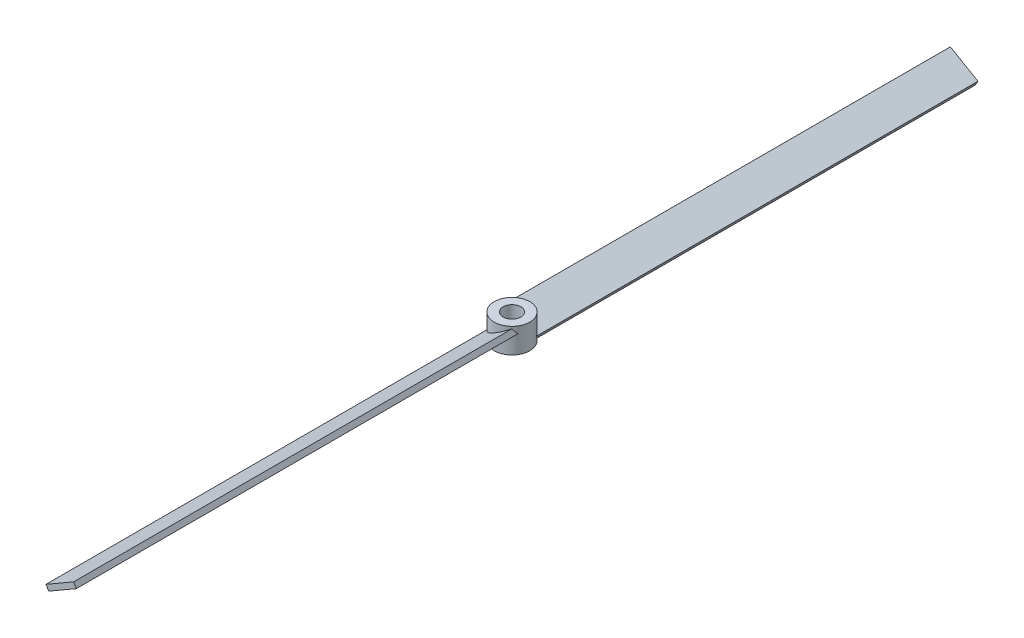
ISO-10303-21;
HEADER;
FILE_DESCRIPTION(('STEP AP214'),'2;1');
FILE_NAME('part.step','',(''),(''),'','','');
FILE_SCHEMA(('AUTOMOTIVE_DESIGN { 1 0 10303 214 1 1 1 1 }'));
ENDSEC;
DATA;
#1=APPLICATION_CONTEXT('core data for automotive mechanical design processes');
#2=APPLICATION_PROTOCOL_DEFINITION('international standard','automotive_design',2000,#1);
#3=PRODUCT_CONTEXT('',#1,'mechanical');
#4=PRODUCT('Part','Part','',(#3));
#5=PRODUCT_RELATED_PRODUCT_CATEGORY('part','',(#4));
#6=PRODUCT_DEFINITION_FORMATION('','',#4);
#7=PRODUCT_DEFINITION_CONTEXT('part definition',#1,'design');
#8=PRODUCT_DEFINITION('design','',#6,#7);
#9=PRODUCT_DEFINITION_SHAPE('','',#8);
#10=(LENGTH_UNIT() NAMED_UNIT(*) SI_UNIT(.MILLI.,.METRE.));
#11=(NAMED_UNIT(*) PLANE_ANGLE_UNIT() SI_UNIT($,.RADIAN.));
#12=(NAMED_UNIT(*) SI_UNIT($,.STERADIAN.) SOLID_ANGLE_UNIT());
#13=UNCERTAINTY_MEASURE_WITH_UNIT(LENGTH_MEASURE(1.E-05),#10,'distance_accuracy_value','');
#14=(GEOMETRIC_REPRESENTATION_CONTEXT(3) GLOBAL_UNCERTAINTY_ASSIGNED_CONTEXT((#13)) GLOBAL_UNIT_ASSIGNED_CONTEXT((#10,
#11,#12)) REPRESENTATION_CONTEXT('',''));
#15=CARTESIAN_POINT('',(0.,0.,0.));
#16=DIRECTION('',(0.,0.,1.));
#17=DIRECTION('',(1.,0.,0.));
#18=AXIS2_PLACEMENT_3D('',#15,#16,#17);
#19=CARTESIAN_POINT('',(0.,7.,0.));
#20=DIRECTION('',(0.,-1.,0.));
#21=DIRECTION('',(0.,0.,-1.));
#22=AXIS2_PLACEMENT_3D('',#19,#20,#21);
#23=CYLINDRICAL_SURFACE('',#22,5.);
#24=CARTESIAN_POINT('',(0.,-5.50000000000009,0.));
#25=DIRECTION('',(0.866025403784442,0.499999999999995,0.));
#26=DIRECTION('',(0.499999999999995,-0.866025403784442,0.));
#27=AXIS2_PLACEMENT_3D('',#24,#25,#26);
#28=ELLIPSE('',#27,10.0000000000001,5.);
#29=CARTESIAN_POINT('',(-4.27211431702998,1.89951905283836,2.59789131070332));
#30=VERTEX_POINT('',#29);
#31=CARTESIAN_POINT('',(-3.52211431702999,0.600480947161693,3.54890275124196));
#32=VERTEX_POINT('',#31);
#33=EDGE_CURVE('E157',#30,#32,#28,.T.);
#34=ORIENTED_EDGE('',*,*,#33,.F.);
#35=CARTESIAN_POINT('',(0.,4.36602540378444,0.));
#36=DIRECTION('',(0.499999999999995,-0.866025403784442,0.));
#37=DIRECTION('',(-0.866025403784442,-0.499999999999995,0.));
#38=AXIS2_PLACEMENT_3D('',#35,#36,#37);
#39=ELLIPSE('',#38,5.77350269189624,5.);
#40=CARTESIAN_POINT('',(3.52211431702999,6.39951905283831,3.54890275124196));
#41=VERTEX_POINT('',#40);
#42=EDGE_CURVE('E146',#41,#30,#39,.T.);
#43=ORIENTED_EDGE('',*,*,#42,.F.);
#44=CARTESIAN_POINT('',(0.,12.5000000000001,0.));
#45=DIRECTION('',(-0.866025403784442,-0.499999999999995,0.));
#46=DIRECTION('',(0.499999999999995,-0.866025403784442,0.));
#47=AXIS2_PLACEMENT_3D('',#44,#45,#46);
#48=ELLIPSE('',#47,10.0000000000001,5.);
#49=CARTESIAN_POINT('',(4.27211431702998,5.10048094716165,2.59789131070326));
#50=VERTEX_POINT('',#49);
#51=EDGE_CURVE('E151',#50,#41,#48,.T.);
#52=ORIENTED_EDGE('',*,*,#51,.F.);
#53=CARTESIAN_POINT('',(0.,2.63397459621557,0.));
#54=DIRECTION('',(-0.499999999999995,0.866025403784441,0.));
#55=DIRECTION('',(-0.866025403784442,-0.499999999999995,0.));
#56=AXIS2_PLACEMENT_3D('',#53,#54,#55);
#57=ELLIPSE('',#56,5.77350269189624,5.);
#58=EDGE_CURVE('E154',#32,#50,#57,.T.);
#59=ORIENTED_EDGE('',*,*,#58,.F.);
#60=EDGE_LOOP('',(#34,#43,#52,#59));
#61=FACE_BOUND('',#60,.T.);
#62=CARTESIAN_POINT('',(0.,7.,0.));
#63=DIRECTION('',(0.,1.,0.));
#64=DIRECTION('',(0.,0.,1.));
#65=AXIS2_PLACEMENT_3D('',#62,#63,#64);
#66=CIRCLE('',#65,5.);
#67=CARTESIAN_POINT('',(0.,7.,5.));
#68=VERTEX_POINT('',#67);
#69=EDGE_CURVE('E143',#68,#68,#66,.T.);
#70=ORIENTED_EDGE('',*,*,#69,.F.);
#71=EDGE_LOOP('',(#70));
#72=FACE_BOUND('',#71,.T.);
#73=CARTESIAN_POINT('',(0.,0.,0.));
#74=DIRECTION('',(0.,1.,0.));
#75=DIRECTION('',(0.,0.,1.));
#76=AXIS2_PLACEMENT_3D('',#73,#74,#75);
#77=CIRCLE('',#76,5.);
#78=CARTESIAN_POINT('',(0.,0.,5.));
#79=VERTEX_POINT('',#78);
#80=EDGE_CURVE('E142',#79,#79,#77,.T.);
#81=ORIENTED_EDGE('',*,*,#80,.T.);
#82=EDGE_LOOP('',(#81));
#83=FACE_BOUND('',#82,.T.);
#84=CARTESIAN_POINT('',(0.,-5.50000000000009,0.));
#85=DIRECTION('',(-0.866025403784442,0.499999999999995,0.));
#86=DIRECTION('',(-0.499999999999995,-0.866025403784442,0.));
#87=AXIS2_PLACEMENT_3D('',#84,#85,#86);
#88=ELLIPSE('',#87,10.0000000000001,5.);
#89=CARTESIAN_POINT('',(4.27211431702998,1.89951905283836,-2.59789131070332));
#90=VERTEX_POINT('',#89);
#91=CARTESIAN_POINT('',(3.52211431702999,0.600480947161693,-3.54890275124196));
#92=VERTEX_POINT('',#91);
#93=EDGE_CURVE('E11',#90,#92,#88,.T.);
#94=ORIENTED_EDGE('',*,*,#93,.F.);
#95=CARTESIAN_POINT('',(0.,4.36602540378444,0.));
#96=DIRECTION('',(-0.499999999999995,-0.866025403784442,0.));
#97=DIRECTION('',(0.866025403784442,-0.499999999999995,0.));
#98=AXIS2_PLACEMENT_3D('',#95,#96,#97);
#99=ELLIPSE('',#98,5.77350269189624,5.);
#100=CARTESIAN_POINT('',(-3.52211431702999,6.39951905283831,-3.54890275124196));
#101=VERTEX_POINT('',#100);
#102=EDGE_CURVE('E160',#101,#90,#99,.T.);
#103=ORIENTED_EDGE('',*,*,#102,.F.);
#104=CARTESIAN_POINT('',(0.,12.5000000000001,0.));
#105=DIRECTION('',(0.866025403784442,-0.499999999999995,0.));
#106=DIRECTION('',(-0.499999999999995,-0.866025403784442,0.));
#107=AXIS2_PLACEMENT_3D('',#104,#105,#106);
#108=ELLIPSE('',#107,10.0000000000001,5.);
#109=CARTESIAN_POINT('',(-4.27211431702998,5.10048094716165,-2.59789131070326));
#110=VERTEX_POINT('',#109);
#111=EDGE_CURVE('E51',#110,#101,#108,.T.);
#112=ORIENTED_EDGE('',*,*,#111,.F.);
#113=CARTESIAN_POINT('',(0.,2.63397459621557,0.));
#114=DIRECTION('',(0.499999999999995,0.866025403784441,0.));
#115=DIRECTION('',(0.866025403784442,-0.499999999999995,0.));
#116=AXIS2_PLACEMENT_3D('',#113,#114,#115);
#117=ELLIPSE('',#116,5.77350269189624,5.);
#118=EDGE_CURVE('E41',#92,#110,#117,.T.);
#119=ORIENTED_EDGE('',*,*,#118,.F.);
#120=EDGE_LOOP('',(#94,#103,#112,#119));
#121=FACE_BOUND('',#120,.T.);
#122=ADVANCED_FACE('F34',(#61,#72,#83,#121),#23,.T.);
#123=CARTESIAN_POINT('',(0.,7.,0.));
#124=DIRECTION('',(0.,1.,0.));
#125=DIRECTION('',(0.,0.,1.));
#126=AXIS2_PLACEMENT_3D('',#123,#124,#125);
#127=PLANE('',#126);
#128=CARTESIAN_POINT('',(0.,7.,0.));
#129=DIRECTION('',(0.,1.,0.));
#130=DIRECTION('',(0.,0.,1.));
#131=AXIS2_PLACEMENT_3D('',#128,#129,#130);
#132=CIRCLE('',#131,2.5);
#133=CARTESIAN_POINT('',(0.,7.,2.5));
#134=VERTEX_POINT('',#133);
#135=EDGE_CURVE('E231',#134,#134,#132,.T.);
#136=ORIENTED_EDGE('',*,*,#135,.F.);
#137=EDGE_LOOP('',(#136));
#138=FACE_BOUND('',#137,.T.);
#139=ORIENTED_EDGE('',*,*,#69,.T.);
#140=EDGE_LOOP('',(#139));
#141=FACE_BOUND('',#140,.T.);
#142=ADVANCED_FACE('F174',(#138,#141),#127,.T.);
#143=CARTESIAN_POINT('',(0.,0.,0.));
#144=DIRECTION('',(0.,1.,0.));
#145=DIRECTION('',(0.,0.,1.));
#146=AXIS2_PLACEMENT_3D('',#143,#144,#145);
#147=PLANE('',#146);
#148=CARTESIAN_POINT('',(0.,0.,0.));
#149=DIRECTION('',(0.,1.,0.));
#150=DIRECTION('',(0.,0.,1.));
#151=AXIS2_PLACEMENT_3D('',#148,#149,#150);
#152=CIRCLE('',#151,2.5);
#153=CARTESIAN_POINT('',(0.,0.,2.5));
#154=VERTEX_POINT('',#153);
#155=EDGE_CURVE('E113',#154,#154,#152,.F.);
#156=ORIENTED_EDGE('',*,*,#155,.F.);
#157=EDGE_LOOP('',(#156));
#158=FACE_BOUND('',#157,.T.);
#159=ORIENTED_EDGE('',*,*,#80,.F.);
#160=EDGE_LOOP('',(#159));
#161=FACE_BOUND('',#160,.T.);
#162=ADVANCED_FACE('F179',(#158,#161),#147,.F.);
#163=CARTESIAN_POINT('',(-4.27211431702998,1.89951905283836,127.));
#164=DIRECTION('',(0.866025403784442,0.499999999999995,0.));
#165=DIRECTION('',(-0.499999999999995,0.866025403784442,0.));
#166=AXIS2_PLACEMENT_3D('',#163,#164,#165);
#167=PLANE('',#166);
#168=DIRECTION('',(0.,0.,-1.));
#169=VECTOR('',#168,1.);
#170=CARTESIAN_POINT('',(-4.27211431702998,1.89951905283836,127.));
#171=LINE('',#170,#169);
#172=CARTESIAN_POINT('',(-4.27211431702998,1.89951905283836,127.));
#173=VERTEX_POINT('',#172);
#174=EDGE_CURVE('E130',#173,#30,#171,.T.);
#175=ORIENTED_EDGE('',*,*,#174,.T.);
#176=ORIENTED_EDGE('',*,*,#33,.T.);
#177=DIRECTION('',(0.,0.,-1.));
#178=VECTOR('',#177,1.);
#179=CARTESIAN_POINT('',(-3.52211431702999,0.600480947161693,127.));
#180=LINE('',#179,#178);
#181=CARTESIAN_POINT('',(-3.52211431702999,0.600480947161693,127.));
#182=VERTEX_POINT('',#181);
#183=EDGE_CURVE('E139',#182,#32,#180,.T.);
#184=ORIENTED_EDGE('',*,*,#183,.F.);
#185=DIRECTION('',(0.499999999999995,-0.866025403784442,0.));
#186=VECTOR('',#185,1.);
#187=CARTESIAN_POINT('',(-4.27211431702998,1.89951905283836,127.));
#188=LINE('',#187,#186);
#189=EDGE_CURVE('E116',#173,#182,#188,.T.);
#190=ORIENTED_EDGE('',*,*,#189,.F.);
#191=EDGE_LOOP('',(#175,#176,#184,#190));
#192=FACE_BOUND('',#191,.T.);
#193=ADVANCED_FACE('F188',(#192),#167,.F.);
#194=CARTESIAN_POINT('',(-3.52211431702999,0.600480947161693,127.));
#195=DIRECTION('',(-0.499999999999995,0.866025403784441,0.));
#196=DIRECTION('',(-0.866025403784442,-0.499999999999995,0.));
#197=AXIS2_PLACEMENT_3D('',#194,#195,#196);
#198=PLANE('',#197);
#199=ORIENTED_EDGE('',*,*,#183,.T.);
#200=ORIENTED_EDGE('',*,*,#58,.T.);
#201=DIRECTION('',(0.,0.,-1.));
#202=VECTOR('',#201,1.);
#203=CARTESIAN_POINT('',(4.27211431702998,5.10048094716165,127.));
#204=LINE('',#203,#202);
#205=CARTESIAN_POINT('',(4.27211431702998,5.10048094716165,127.));
#206=VERTEX_POINT('',#205);
#207=EDGE_CURVE('E136',#206,#50,#204,.T.);
#208=ORIENTED_EDGE('',*,*,#207,.F.);
#209=DIRECTION('',(0.866025403784441,0.499999999999995,0.));
#210=VECTOR('',#209,1.);
#211=CARTESIAN_POINT('',(-3.52211431702999,0.600480947161693,127.));
#212=LINE('',#211,#210);
#213=EDGE_CURVE('E119',#182,#206,#212,.T.);
#214=ORIENTED_EDGE('',*,*,#213,.F.);
#215=EDGE_LOOP('',(#199,#200,#208,#214));
#216=FACE_BOUND('',#215,.T.);
#217=ADVANCED_FACE('F193',(#216),#198,.F.);
#218=CARTESIAN_POINT('',(3.52211431702999,6.39951905283831,127.));
#219=DIRECTION('',(-0.866025403784442,-0.499999999999995,0.));
#220=DIRECTION('',(0.499999999999995,-0.866025403784442,0.));
#221=AXIS2_PLACEMENT_3D('',#218,#219,#220);
#222=PLANE('',#221);
#223=ORIENTED_EDGE('',*,*,#207,.T.);
#224=ORIENTED_EDGE('',*,*,#51,.T.);
#225=DIRECTION('',(0.,0.,-1.));
#226=VECTOR('',#225,1.);
#227=CARTESIAN_POINT('',(3.52211431702999,6.39951905283831,127.));
#228=LINE('',#227,#226);
#229=CARTESIAN_POINT('',(3.52211431702999,6.39951905283831,127.));
#230=VERTEX_POINT('',#229);
#231=EDGE_CURVE('E133',#230,#41,#228,.T.);
#232=ORIENTED_EDGE('',*,*,#231,.F.);
#233=DIRECTION('',(-0.499999999999995,0.866025403784442,0.));
#234=VECTOR('',#233,1.);
#235=CARTESIAN_POINT('',(3.52211431702999,6.39951905283831,127.));
#236=LINE('',#235,#234);
#237=EDGE_CURVE('E126',#206,#230,#236,.T.);
#238=ORIENTED_EDGE('',*,*,#237,.F.);
#239=EDGE_LOOP('',(#223,#224,#232,#238));
#240=FACE_BOUND('',#239,.T.);
#241=ADVANCED_FACE('F200',(#240),#222,.F.);
#242=CARTESIAN_POINT('',(-4.27211431702998,1.89951905283836,127.));
#243=DIRECTION('',(0.499999999999995,-0.866025403784442,0.));
#244=DIRECTION('',(0.866025403784442,0.499999999999995,0.));
#245=AXIS2_PLACEMENT_3D('',#242,#243,#244);
#246=PLANE('',#245);
#247=ORIENTED_EDGE('',*,*,#231,.T.);
#248=ORIENTED_EDGE('',*,*,#42,.T.);
#249=ORIENTED_EDGE('',*,*,#174,.F.);
#250=DIRECTION('',(-0.866025403784442,-0.499999999999995,0.));
#251=VECTOR('',#250,1.);
#252=CARTESIAN_POINT('',(-4.27211431702998,1.89951905283836,127.));
#253=LINE('',#252,#251);
#254=EDGE_CURVE('E128',#230,#173,#253,.T.);
#255=ORIENTED_EDGE('',*,*,#254,.F.);
#256=EDGE_LOOP('',(#247,#248,#249,#255));
#257=FACE_BOUND('',#256,.T.);
#258=ADVANCED_FACE('F204',(#257),#246,.F.);
#259=CARTESIAN_POINT('',(0.,0.,127.));
#260=DIRECTION('',(0.,0.,1.));
#261=DIRECTION('',(1.,0.,0.));
#262=AXIS2_PLACEMENT_3D('',#259,#260,#261);
#263=PLANE('',#262);
#264=ORIENTED_EDGE('',*,*,#189,.T.);
#265=ORIENTED_EDGE('',*,*,#213,.T.);
#266=ORIENTED_EDGE('',*,*,#237,.T.);
#267=ORIENTED_EDGE('',*,*,#254,.T.);
#268=EDGE_LOOP('',(#264,#265,#266,#267));
#269=FACE_BOUND('',#268,.T.);
#270=ADVANCED_FACE('F208',(#269),#263,.T.);
#271=CARTESIAN_POINT('',(4.27211431702998,1.89951905283836,-127.));
#272=DIRECTION('',(-0.866025403784442,0.499999999999995,0.));
#273=DIRECTION('',(-0.499999999999995,-0.866025403784442,0.));
#274=AXIS2_PLACEMENT_3D('',#271,#272,#273);
#275=PLANE('',#274);
#276=DIRECTION('',(0.,0.,1.));
#277=VECTOR('',#276,1.);
#278=CARTESIAN_POINT('',(4.27211431702998,1.89951905283836,-127.));
#279=LINE('',#278,#277);
#280=CARTESIAN_POINT('',(4.27211431702998,1.89951905283836,-127.));
#281=VERTEX_POINT('',#280);
#282=EDGE_CURVE('E168',#281,#90,#279,.T.);
#283=ORIENTED_EDGE('',*,*,#282,.T.);
#284=ORIENTED_EDGE('',*,*,#93,.T.);
#285=DIRECTION('',(0.,0.,1.));
#286=VECTOR('',#285,1.);
#287=CARTESIAN_POINT('',(3.52211431702999,0.600480947161693,-127.));
#288=LINE('',#287,#286);
#289=CARTESIAN_POINT('',(3.52211431702999,0.600480947161693,-127.));
#290=VERTEX_POINT('',#289);
#291=EDGE_CURVE('E98',#290,#92,#288,.T.);
#292=ORIENTED_EDGE('',*,*,#291,.F.);
#293=DIRECTION('',(-0.499999999999995,-0.866025403784442,0.));
#294=VECTOR('',#293,1.);
#295=CARTESIAN_POINT('',(4.27211431702998,1.89951905283836,-127.));
#296=LINE('',#295,#294);
#297=EDGE_CURVE('E104',#281,#290,#296,.T.);
#298=ORIENTED_EDGE('',*,*,#297,.F.);
#299=EDGE_LOOP('',(#283,#284,#292,#298));
#300=FACE_BOUND('',#299,.T.);
#301=ADVANCED_FACE('F115',(#300),#275,.F.);
#302=CARTESIAN_POINT('',(3.52211431702999,0.600480947161693,-127.));
#303=DIRECTION('',(0.499999999999995,0.866025403784441,0.));
#304=DIRECTION('',(-0.866025403784442,0.499999999999995,0.));
#305=AXIS2_PLACEMENT_3D('',#302,#303,#304);
#306=PLANE('',#305);
#307=ORIENTED_EDGE('',*,*,#291,.T.);
#308=ORIENTED_EDGE('',*,*,#118,.T.);
#309=DIRECTION('',(0.,0.,1.));
#310=VECTOR('',#309,1.);
#311=CARTESIAN_POINT('',(-4.27211431702998,5.10048094716165,-127.));
#312=LINE('',#311,#310);
#313=CARTESIAN_POINT('',(-4.27211431702998,5.10048094716165,-127.));
#314=VERTEX_POINT('',#313);
#315=EDGE_CURVE('E100',#314,#110,#312,.T.);
#316=ORIENTED_EDGE('',*,*,#315,.F.);
#317=DIRECTION('',(-0.866025403784441,0.499999999999995,0.));
#318=VECTOR('',#317,1.);
#319=CARTESIAN_POINT('',(3.52211431702999,0.600480947161693,-127.));
#320=LINE('',#319,#318);
#321=EDGE_CURVE('E94',#290,#314,#320,.T.);
#322=ORIENTED_EDGE('',*,*,#321,.F.);
#323=EDGE_LOOP('',(#307,#308,#316,#322));
#324=FACE_BOUND('',#323,.T.);
#325=ADVANCED_FACE('F96',(#324),#306,.F.);
#326=CARTESIAN_POINT('',(-3.52211431702999,6.39951905283831,-127.));
#327=DIRECTION('',(0.866025403784442,-0.499999999999995,0.));
#328=DIRECTION('',(0.499999999999995,0.866025403784442,0.));
#329=AXIS2_PLACEMENT_3D('',#326,#327,#328);
#330=PLANE('',#329);
#331=ORIENTED_EDGE('',*,*,#315,.T.);
#332=ORIENTED_EDGE('',*,*,#111,.T.);
#333=DIRECTION('',(0.,0.,1.));
#334=VECTOR('',#333,1.);
#335=CARTESIAN_POINT('',(-3.52211431702999,6.39951905283831,-127.));
#336=LINE('',#335,#334);
#337=CARTESIAN_POINT('',(-3.52211431702999,6.39951905283831,-127.));
#338=VERTEX_POINT('',#337);
#339=EDGE_CURVE('E121',#338,#101,#336,.T.);
#340=ORIENTED_EDGE('',*,*,#339,.F.);
#341=DIRECTION('',(0.499999999999995,0.866025403784442,0.));
#342=VECTOR('',#341,1.);
#343=CARTESIAN_POINT('',(-3.52211431702999,6.39951905283831,-127.));
#344=LINE('',#343,#342);
#345=EDGE_CURVE('E103',#314,#338,#344,.T.);
#346=ORIENTED_EDGE('',*,*,#345,.F.);
#347=EDGE_LOOP('',(#331,#332,#340,#346));
#348=FACE_BOUND('',#347,.T.);
#349=ADVANCED_FACE('F164',(#348),#330,.F.);
#350=CARTESIAN_POINT('',(4.27211431702998,1.89951905283836,-127.));
#351=DIRECTION('',(-0.499999999999995,-0.866025403784442,0.));
#352=DIRECTION('',(0.866025403784442,-0.499999999999995,0.));
#353=AXIS2_PLACEMENT_3D('',#350,#351,#352);
#354=PLANE('',#353);
#355=ORIENTED_EDGE('',*,*,#339,.T.);
#356=ORIENTED_EDGE('',*,*,#102,.T.);
#357=ORIENTED_EDGE('',*,*,#282,.F.);
#358=DIRECTION('',(0.866025403784442,-0.499999999999995,0.));
#359=VECTOR('',#358,1.);
#360=CARTESIAN_POINT('',(4.27211431702998,1.89951905283836,-127.));
#361=LINE('',#360,#359);
#362=EDGE_CURVE('E109',#338,#281,#361,.T.);
#363=ORIENTED_EDGE('',*,*,#362,.F.);
#364=EDGE_LOOP('',(#355,#356,#357,#363));
#365=FACE_BOUND('',#364,.T.);
#366=ADVANCED_FACE('F172',(#365),#354,.F.);
#367=CARTESIAN_POINT('',(0.,0.,-127.));
#368=DIRECTION('',(0.,0.,-1.));
#369=DIRECTION('',(-1.,0.,0.));
#370=AXIS2_PLACEMENT_3D('',#367,#368,#369);
#371=PLANE('',#370);
#372=ORIENTED_EDGE('',*,*,#297,.T.);
#373=ORIENTED_EDGE('',*,*,#321,.T.);
#374=ORIENTED_EDGE('',*,*,#345,.T.);
#375=ORIENTED_EDGE('',*,*,#362,.T.);
#376=EDGE_LOOP('',(#372,#373,#374,#375));
#377=FACE_BOUND('',#376,.T.);
#378=ADVANCED_FACE('F107',(#377),#371,.T.);
#379=CARTESIAN_POINT('',(0.,-0.00100000000000013,0.));
#380=DIRECTION('',(0.,1.,0.));
#381=DIRECTION('',(0.,0.,1.));
#382=AXIS2_PLACEMENT_3D('',#379,#380,#381);
#383=CYLINDRICAL_SURFACE('',#382,2.5);
#384=ORIENTED_EDGE('',*,*,#135,.T.);
#385=EDGE_LOOP('',(#384));
#386=FACE_BOUND('',#385,.T.);
#387=ORIENTED_EDGE('',*,*,#155,.T.);
#388=EDGE_LOOP('',(#387));
#389=FACE_BOUND('',#388,.T.);
#390=ADVANCED_FACE('F223',(#386,#389),#383,.F.);
#391=CLOSED_SHELL('',(#122,#142,#162,#193,#217,#241,#258,#270,#301,#325,#349,#366,#378,#390));
#392=MANIFOLD_SOLID_BREP('B2',#391);
#393=ADVANCED_BREP_SHAPE_REPRESENTATION('',(#18,#392),#14);
#394=SHAPE_DEFINITION_REPRESENTATION(#9,#393);
ENDSEC;
END-ISO-10303-21;
